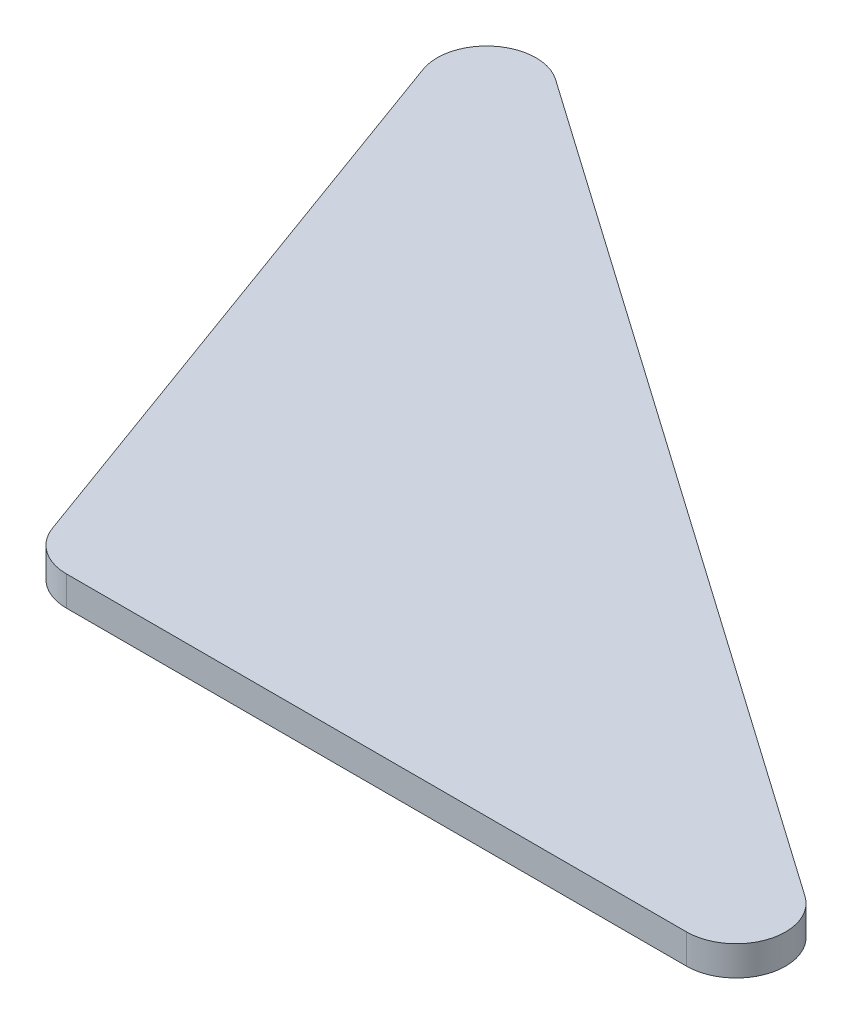
ISO-10303-21;
HEADER;
FILE_DESCRIPTION(('STEP AP214'),'2;1');
FILE_NAME('part.step','',(''),(''),'','','');
FILE_SCHEMA(('AUTOMOTIVE_DESIGN { 1 0 10303 214 1 1 1 1 }'));
ENDSEC;
DATA;
#1=APPLICATION_CONTEXT('core data for automotive mechanical design processes');
#2=APPLICATION_PROTOCOL_DEFINITION('international standard','automotive_design',2000,#1);
#3=PRODUCT_CONTEXT('',#1,'mechanical');
#4=PRODUCT('Part','Part','',(#3));
#5=PRODUCT_RELATED_PRODUCT_CATEGORY('part','',(#4));
#6=PRODUCT_DEFINITION_FORMATION('','',#4);
#7=PRODUCT_DEFINITION_CONTEXT('part definition',#1,'design');
#8=PRODUCT_DEFINITION('design','',#6,#7);
#9=PRODUCT_DEFINITION_SHAPE('','',#8);
#10=(LENGTH_UNIT() NAMED_UNIT(*) SI_UNIT(.MILLI.,.METRE.));
#11=(NAMED_UNIT(*) PLANE_ANGLE_UNIT() SI_UNIT($,.RADIAN.));
#12=(NAMED_UNIT(*) SI_UNIT($,.STERADIAN.) SOLID_ANGLE_UNIT());
#13=UNCERTAINTY_MEASURE_WITH_UNIT(LENGTH_MEASURE(1.E-05),#10,'distance_accuracy_value','');
#14=(GEOMETRIC_REPRESENTATION_CONTEXT(3) GLOBAL_UNCERTAINTY_ASSIGNED_CONTEXT((#13)) GLOBAL_UNIT_ASSIGNED_CONTEXT((#10,
#11,#12)) REPRESENTATION_CONTEXT('',''));
#15=CARTESIAN_POINT('',(0.,0.,0.));
#16=DIRECTION('',(0.,0.,1.));
#17=DIRECTION('',(1.,0.,0.));
#18=AXIS2_PLACEMENT_3D('',#15,#16,#17);
#19=CARTESIAN_POINT('',(-28.0456517527046,3.,-77.0547949044446));
#20=DIRECTION('',(0.939692620785909,0.,-0.342020143325666));
#21=DIRECTION('',(-0.342020143325666,0.,-0.939692620785909));
#22=AXIS2_PLACEMENT_3D('',#19,#20,#21);
#23=PLANE('',#22);
#24=DIRECTION('',(0.342020143325666,0.,0.939692620785909));
#25=VECTOR('',#24,1.);
#26=CARTESIAN_POINT('',(-28.0456517527046,3.,-77.0547949044446));
#27=LINE('',#26,#25);
#28=CARTESIAN_POINT('',(-22.6219052083286,3.,-62.1531737449263));
#29=VERTEX_POINT('',#28);
#30=CARTESIAN_POINT('',(-1.19742541288098,3.,-3.28989928337167));
#31=VERTEX_POINT('',#30);
#32=EDGE_CURVE('E107',#29,#31,#27,.T.);
#33=ORIENTED_EDGE('',*,*,#32,.F.);
#34=DIRECTION('',(0.,-1.,0.));
#35=VECTOR('',#34,1.);
#36=CARTESIAN_POINT('',(-22.6219052083286,3.,-62.1531737449263));
#37=LINE('',#36,#35);
#38=CARTESIAN_POINT('',(-22.6219052083286,0.,-62.1531737449263));
#39=VERTEX_POINT('',#38);
#40=EDGE_CURVE('E93',#29,#39,#37,.T.);
#41=ORIENTED_EDGE('',*,*,#40,.T.);
#42=DIRECTION('',(0.342020143325666,0.,0.939692620785909));
#43=VECTOR('',#42,1.);
#44=CARTESIAN_POINT('',(-28.0456517527046,0.,-77.0547949044446));
#45=LINE('',#44,#43);
#46=CARTESIAN_POINT('',(-1.19742541288098,0.,-3.28989928337167));
#47=VERTEX_POINT('',#46);
#48=EDGE_CURVE('E105',#39,#47,#45,.T.);
#49=ORIENTED_EDGE('',*,*,#48,.T.);
#50=DIRECTION('',(0.,-1.,0.));
#51=VECTOR('',#50,1.);
#52=CARTESIAN_POINT('',(-1.19742541288098,3.,-3.28989928337167));
#53=LINE('',#52,#51);
#54=EDGE_CURVE('E109',#47,#31,#53,.F.);
#55=ORIENTED_EDGE('',*,*,#54,.T.);
#56=EDGE_LOOP('',(#33,#41,#49,#55));
#57=FACE_BOUND('',#56,.T.);
#58=ADVANCED_FACE('F35',(#57),#23,.F.);
#59=CARTESIAN_POINT('',(0.,3.,0.));
#60=DIRECTION('',(0.,0.,-1.));
#61=DIRECTION('',(-1.,0.,0.));
#62=AXIS2_PLACEMENT_3D('',#59,#60,#61);
#63=PLANE('',#62);
#64=DIRECTION('',(1.,0.,0.));
#65=VECTOR('',#64,1.);
#66=CARTESIAN_POINT('',(0.,3.,0.));
#67=LINE('',#66,#65);
#68=CARTESIAN_POINT('',(3.50103769104856,3.,0.));
#69=VERTEX_POINT('',#68);
#70=CARTESIAN_POINT('',(66.142025988184,3.,0.));
#71=VERTEX_POINT('',#70);
#72=EDGE_CURVE('E138',#69,#71,#67,.T.);
#73=ORIENTED_EDGE('',*,*,#72,.F.);
#74=DIRECTION('',(0.,-1.,0.));
#75=VECTOR('',#74,1.);
#76=CARTESIAN_POINT('',(3.50103769104856,3.,0.));
#77=LINE('',#76,#75);
#78=CARTESIAN_POINT('',(3.50103769104856,0.,0.));
#79=VERTEX_POINT('',#78);
#80=EDGE_CURVE('E11',#69,#79,#77,.T.);
#81=ORIENTED_EDGE('',*,*,#80,.T.);
#82=DIRECTION('',(1.,0.,0.));
#83=VECTOR('',#82,1.);
#84=CARTESIAN_POINT('',(0.,0.,0.));
#85=LINE('',#84,#83);
#86=CARTESIAN_POINT('',(66.142025988184,0.,0.));
#87=VERTEX_POINT('',#86);
#88=EDGE_CURVE('E113',#79,#87,#85,.T.);
#89=ORIENTED_EDGE('',*,*,#88,.T.);
#90=DIRECTION('',(0.,-1.,0.));
#91=VECTOR('',#90,1.);
#92=CARTESIAN_POINT('',(66.142025988184,3.,0.));
#93=LINE('',#92,#91);
#94=EDGE_CURVE('E43',#87,#71,#93,.F.);
#95=ORIENTED_EDGE('',*,*,#94,.T.);
#96=EDGE_LOOP('',(#73,#81,#89,#95));
#97=FACE_BOUND('',#96,.T.);
#98=ADVANCED_FACE('F143',(#97),#63,.F.);
#99=CARTESIAN_POINT('',(82.,3.,0.));
#100=DIRECTION('',(-0.573576436351047,0.,0.819152044288991));
#101=DIRECTION('',(0.819152044288991,0.,0.573576436351047));
#102=AXIS2_PLACEMENT_3D('',#99,#100,#101);
#103=PLANE('',#102);
#104=DIRECTION('',(-0.819152044288991,0.,-0.573576436351047));
#105=VECTOR('',#104,1.);
#106=CARTESIAN_POINT('',(82.,0.,0.));
#107=LINE('',#106,#105);
#108=CARTESIAN_POINT('',(69.0099081699392,0.,-9.09576022144496));
#109=VERTEX_POINT('',#108);
#110=CARTESIAN_POINT('',(-15.0555599226439,0.,-67.9590346829996));
#111=VERTEX_POINT('',#110);
#112=EDGE_CURVE('E115',#109,#111,#107,.T.);
#113=ORIENTED_EDGE('',*,*,#112,.T.);
#114=DIRECTION('',(0.,-1.,0.));
#115=VECTOR('',#114,1.);
#116=CARTESIAN_POINT('',(-15.0555599226438,3.,-67.9590346829996));
#117=LINE('',#116,#115);
#118=CARTESIAN_POINT('',(-15.0555599226439,3.,-67.9590346829996));
#119=VERTEX_POINT('',#118);
#120=EDGE_CURVE('E94',#111,#119,#117,.F.);
#121=ORIENTED_EDGE('',*,*,#120,.T.);
#122=DIRECTION('',(-0.819152044288991,0.,-0.573576436351047));
#123=VECTOR('',#122,1.);
#124=CARTESIAN_POINT('',(82.,3.,0.));
#125=LINE('',#124,#123);
#126=CARTESIAN_POINT('',(69.0099081699392,3.,-9.09576022144496));
#127=VERTEX_POINT('',#126);
#128=EDGE_CURVE('E118',#127,#119,#125,.T.);
#129=ORIENTED_EDGE('',*,*,#128,.F.);
#130=DIRECTION('',(0.,-1.,0.));
#131=VECTOR('',#130,1.);
#132=CARTESIAN_POINT('',(69.0099081699392,3.,-9.09576022144496));
#133=LINE('',#132,#131);
#134=EDGE_CURVE('E99',#127,#109,#133,.T.);
#135=ORIENTED_EDGE('',*,*,#134,.T.);
#136=EDGE_LOOP('',(#113,#121,#129,#135));
#137=FACE_BOUND('',#136,.T.);
#138=ADVANCED_FACE('F142',(#137),#103,.F.);
#139=CARTESIAN_POINT('',(0.,3.,0.));
#140=DIRECTION('',(0.,1.,0.));
#141=DIRECTION('',(0.,0.,1.));
#142=AXIS2_PLACEMENT_3D('',#139,#140,#141);
#143=PLANE('',#142);
#144=ORIENTED_EDGE('',*,*,#128,.T.);
#145=CARTESIAN_POINT('',(-17.9234421043991,3.,-63.8632744615547));
#146=DIRECTION('',(0.,1.,0.));
#147=DIRECTION('',(0.,0.,1.));
#148=AXIS2_PLACEMENT_3D('',#145,#146,#147);
#149=CIRCLE('',#148,5.);
#150=EDGE_CURVE('E131',#119,#29,#149,.T.);
#151=ORIENTED_EDGE('',*,*,#150,.T.);
#152=ORIENTED_EDGE('',*,*,#32,.T.);
#153=CARTESIAN_POINT('',(3.50103769104856,3.,-5.));
#154=DIRECTION('',(0.,1.,0.));
#155=DIRECTION('',(0.,0.,1.));
#156=AXIS2_PLACEMENT_3D('',#153,#154,#155);
#157=CIRCLE('',#156,5.);
#158=EDGE_CURVE('E56',#31,#69,#157,.T.);
#159=ORIENTED_EDGE('',*,*,#158,.T.);
#160=ORIENTED_EDGE('',*,*,#72,.T.);
#161=CARTESIAN_POINT('',(66.142025988184,3.,-5.));
#162=DIRECTION('',(0.,1.,0.));
#163=DIRECTION('',(0.,0.,1.));
#164=AXIS2_PLACEMENT_3D('',#161,#162,#163);
#165=CIRCLE('',#164,5.);
#166=EDGE_CURVE('E128',#71,#127,#165,.T.);
#167=ORIENTED_EDGE('',*,*,#166,.T.);
#168=EDGE_LOOP('',(#144,#151,#152,#159,#160,#167));
#169=FACE_BOUND('',#168,.T.);
#170=ADVANCED_FACE('F133',(#169),#143,.T.);
#171=CARTESIAN_POINT('',(0.,0.,0.));
#172=DIRECTION('',(0.,1.,0.));
#173=DIRECTION('',(0.,0.,1.));
#174=AXIS2_PLACEMENT_3D('',#171,#172,#173);
#175=PLANE('',#174);
#176=ORIENTED_EDGE('',*,*,#48,.F.);
#177=CARTESIAN_POINT('',(-17.9234421043991,0.,-63.8632744615547));
#178=DIRECTION('',(0.,1.,0.));
#179=DIRECTION('',(0.,0.,1.));
#180=AXIS2_PLACEMENT_3D('',#177,#178,#179);
#181=CIRCLE('',#180,5.);
#182=EDGE_CURVE('E89',#39,#111,#181,.F.);
#183=ORIENTED_EDGE('',*,*,#182,.T.);
#184=ORIENTED_EDGE('',*,*,#112,.F.);
#185=CARTESIAN_POINT('',(66.142025988184,0.,-5.));
#186=DIRECTION('',(0.,1.,0.));
#187=DIRECTION('',(0.,0.,1.));
#188=AXIS2_PLACEMENT_3D('',#185,#186,#187);
#189=CIRCLE('',#188,5.);
#190=EDGE_CURVE('E108',#109,#87,#189,.F.);
#191=ORIENTED_EDGE('',*,*,#190,.T.);
#192=ORIENTED_EDGE('',*,*,#88,.F.);
#193=CARTESIAN_POINT('',(3.50103769104856,0.,-5.));
#194=DIRECTION('',(0.,1.,0.));
#195=DIRECTION('',(0.,0.,1.));
#196=AXIS2_PLACEMENT_3D('',#193,#194,#195);
#197=CIRCLE('',#196,5.);
#198=EDGE_CURVE('E100',#79,#47,#197,.F.);
#199=ORIENTED_EDGE('',*,*,#198,.T.);
#200=EDGE_LOOP('',(#176,#183,#184,#191,#192,#199));
#201=FACE_BOUND('',#200,.T.);
#202=ADVANCED_FACE('F111',(#201),#175,.F.);
#203=CARTESIAN_POINT('',(-17.9234421043991,3.,-63.8632744615547));
#204=DIRECTION('',(0.,-1.,0.));
#205=DIRECTION('',(0.,0.,-1.));
#206=AXIS2_PLACEMENT_3D('',#203,#204,#205);
#207=CYLINDRICAL_SURFACE('',#206,5.);
#208=ORIENTED_EDGE('',*,*,#150,.F.);
#209=ORIENTED_EDGE('',*,*,#120,.F.);
#210=ORIENTED_EDGE('',*,*,#182,.F.);
#211=ORIENTED_EDGE('',*,*,#40,.F.);
#212=EDGE_LOOP('',(#208,#209,#210,#211));
#213=FACE_BOUND('',#212,.T.);
#214=ADVANCED_FACE('F92',(#213),#207,.T.);
#215=CARTESIAN_POINT('',(3.50103769104856,3.,-5.));
#216=DIRECTION('',(0.,-1.,0.));
#217=DIRECTION('',(0.,0.,-1.));
#218=AXIS2_PLACEMENT_3D('',#215,#216,#217);
#219=CYLINDRICAL_SURFACE('',#218,5.);
#220=ORIENTED_EDGE('',*,*,#158,.F.);
#221=ORIENTED_EDGE('',*,*,#54,.F.);
#222=ORIENTED_EDGE('',*,*,#198,.F.);
#223=ORIENTED_EDGE('',*,*,#80,.F.);
#224=EDGE_LOOP('',(#220,#221,#222,#223));
#225=FACE_BOUND('',#224,.T.);
#226=ADVANCED_FACE('F145',(#225),#219,.T.);
#227=CARTESIAN_POINT('',(66.142025988184,3.,-5.));
#228=DIRECTION('',(0.,-1.,0.));
#229=DIRECTION('',(0.,0.,-1.));
#230=AXIS2_PLACEMENT_3D('',#227,#228,#229);
#231=CYLINDRICAL_SURFACE('',#230,5.);
#232=ORIENTED_EDGE('',*,*,#166,.F.);
#233=ORIENTED_EDGE('',*,*,#94,.F.);
#234=ORIENTED_EDGE('',*,*,#190,.F.);
#235=ORIENTED_EDGE('',*,*,#134,.F.);
#236=EDGE_LOOP('',(#232,#233,#234,#235));
#237=FACE_BOUND('',#236,.T.);
#238=ADVANCED_FACE('F37',(#237),#231,.T.);
#239=CLOSED_SHELL('',(#58,#98,#138,#170,#202,#214,#226,#238));
#240=MANIFOLD_SOLID_BREP('B2',#239);
#241=ADVANCED_BREP_SHAPE_REPRESENTATION('',(#18,#240),#14);
#242=SHAPE_DEFINITION_REPRESENTATION(#9,#241);
ENDSEC;
END-ISO-10303-21;
